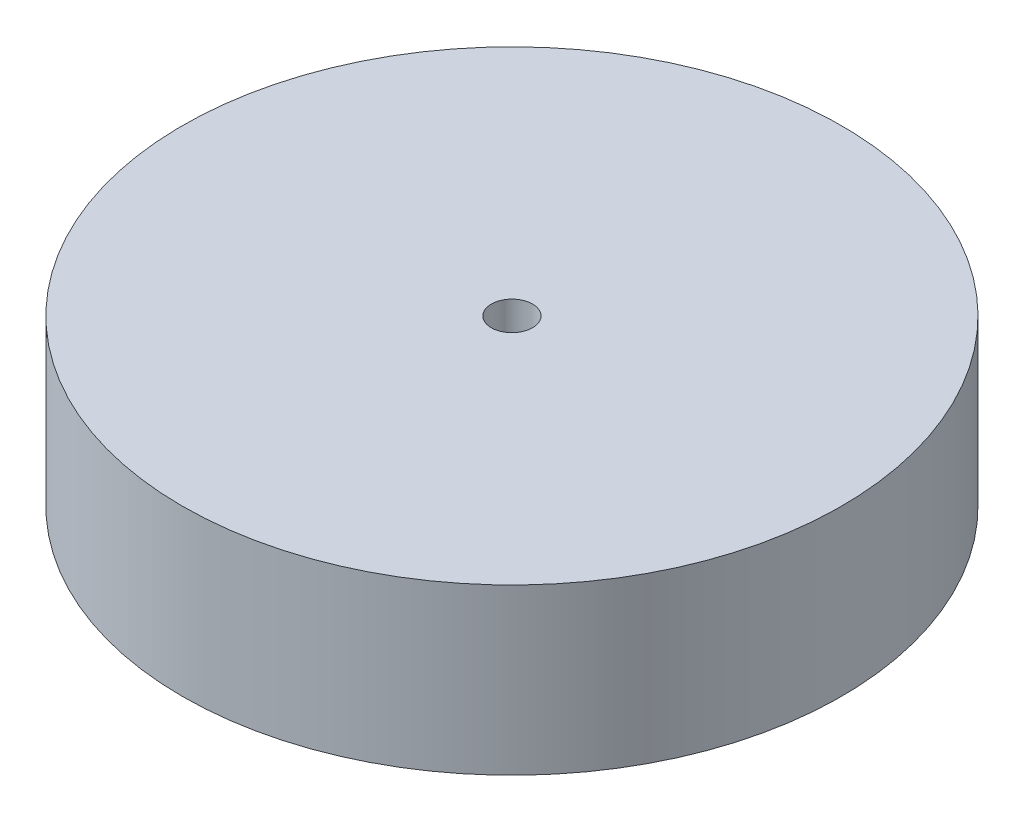
ISO-10303-21;
HEADER;
FILE_DESCRIPTION(('STEP AP214'),'2;1');
FILE_NAME('part.step','',(''),(''),'','','');
FILE_SCHEMA(('AUTOMOTIVE_DESIGN { 1 0 10303 214 1 1 1 1 }'));
ENDSEC;
DATA;
#1=APPLICATION_CONTEXT('core data for automotive mechanical design processes');
#2=APPLICATION_PROTOCOL_DEFINITION('international standard','automotive_design',2000,#1);
#3=PRODUCT_CONTEXT('',#1,'mechanical');
#4=PRODUCT('Part','Part','',(#3));
#5=PRODUCT_RELATED_PRODUCT_CATEGORY('part','',(#4));
#6=PRODUCT_DEFINITION_FORMATION('','',#4);
#7=PRODUCT_DEFINITION_CONTEXT('part definition',#1,'design');
#8=PRODUCT_DEFINITION('design','',#6,#7);
#9=PRODUCT_DEFINITION_SHAPE('','',#8);
#10=(LENGTH_UNIT() NAMED_UNIT(*) SI_UNIT(.MILLI.,.METRE.));
#11=(NAMED_UNIT(*) PLANE_ANGLE_UNIT() SI_UNIT($,.RADIAN.));
#12=(NAMED_UNIT(*) SI_UNIT($,.STERADIAN.) SOLID_ANGLE_UNIT());
#13=UNCERTAINTY_MEASURE_WITH_UNIT(LENGTH_MEASURE(1.E-05),#10,'distance_accuracy_value','');
#14=(GEOMETRIC_REPRESENTATION_CONTEXT(3) GLOBAL_UNCERTAINTY_ASSIGNED_CONTEXT((#13)) GLOBAL_UNIT_ASSIGNED_CONTEXT((#10,
#11,#12)) REPRESENTATION_CONTEXT('',''));
#15=CARTESIAN_POINT('',(0.,0.,0.));
#16=DIRECTION('',(0.,0.,1.));
#17=DIRECTION('',(1.,0.,0.));
#18=AXIS2_PLACEMENT_3D('',#15,#16,#17);
#19=CARTESIAN_POINT('',(0.,31.75,0.));
#20=DIRECTION('',(0.,1.,0.));
#21=DIRECTION('',(0.,0.,1.));
#22=AXIS2_PLACEMENT_3D('',#19,#20,#21);
#23=PLANE('',#22);
#24=CARTESIAN_POINT('',(0.,31.75,0.));
#25=DIRECTION('',(0.,1.,0.));
#26=DIRECTION('',(0.,0.,1.));
#27=AXIS2_PLACEMENT_3D('',#24,#25,#26);
#28=CIRCLE('',#27,63.5);
#29=CARTESIAN_POINT('',(0.,31.75,63.5));
#30=VERTEX_POINT('',#29);
#31=EDGE_CURVE('E10',#30,#30,#28,.T.);
#32=ORIENTED_EDGE('',*,*,#31,.T.);
#33=EDGE_LOOP('',(#32));
#34=FACE_BOUND('',#33,.T.);
#35=CARTESIAN_POINT('',(0.,31.75,0.));
#36=DIRECTION('',(0.,1.,0.));
#37=DIRECTION('',(0.,0.,1.));
#38=AXIS2_PLACEMENT_3D('',#35,#36,#37);
#39=CIRCLE('',#38,3.96875);
#40=CARTESIAN_POINT('',(0.,31.75,3.96875));
#41=VERTEX_POINT('',#40);
#42=EDGE_CURVE('E54',#41,#41,#39,.T.);
#43=ORIENTED_EDGE('',*,*,#42,.F.);
#44=EDGE_LOOP('',(#43));
#45=FACE_BOUND('',#44,.T.);
#46=ADVANCED_FACE('F41',(#34,#45),#23,.T.);
#47=CARTESIAN_POINT('',(0.,0.,0.));
#48=DIRECTION('',(0.,1.,0.));
#49=DIRECTION('',(0.,0.,1.));
#50=AXIS2_PLACEMENT_3D('',#47,#48,#49);
#51=PLANE('',#50);
#52=CARTESIAN_POINT('',(0.,0.,0.));
#53=DIRECTION('',(0.,1.,0.));
#54=DIRECTION('',(0.,0.,1.));
#55=AXIS2_PLACEMENT_3D('',#52,#53,#54);
#56=CIRCLE('',#55,63.5);
#57=CARTESIAN_POINT('',(0.,0.,63.5));
#58=VERTEX_POINT('',#57);
#59=EDGE_CURVE('E45',#58,#58,#56,.T.);
#60=ORIENTED_EDGE('',*,*,#59,.F.);
#61=EDGE_LOOP('',(#60));
#62=FACE_BOUND('',#61,.T.);
#63=CARTESIAN_POINT('',(0.,0.,0.));
#64=DIRECTION('',(0.,1.,0.));
#65=DIRECTION('',(0.,0.,1.));
#66=AXIS2_PLACEMENT_3D('',#63,#64,#65);
#67=CIRCLE('',#66,3.96875);
#68=CARTESIAN_POINT('',(0.,0.,3.96875));
#69=VERTEX_POINT('',#68);
#70=EDGE_CURVE('E56',#69,#69,#67,.T.);
#71=ORIENTED_EDGE('',*,*,#70,.T.);
#72=EDGE_LOOP('',(#71));
#73=FACE_BOUND('',#72,.T.);
#74=ADVANCED_FACE('F68',(#62,#73),#51,.F.);
#75=CARTESIAN_POINT('',(0.,31.75,0.));
#76=DIRECTION('',(0.,-1.,0.));
#77=DIRECTION('',(0.,0.,-1.));
#78=AXIS2_PLACEMENT_3D('',#75,#76,#77);
#79=CYLINDRICAL_SURFACE('',#78,63.5);
#80=ORIENTED_EDGE('',*,*,#31,.F.);
#81=EDGE_LOOP('',(#80));
#82=FACE_BOUND('',#81,.T.);
#83=ORIENTED_EDGE('',*,*,#59,.T.);
#84=EDGE_LOOP('',(#83));
#85=FACE_BOUND('',#84,.T.);
#86=ADVANCED_FACE('F43',(#82,#85),#79,.T.);
#87=CARTESIAN_POINT('',(0.,31.75,0.));
#88=DIRECTION('',(0.,-1.,0.));
#89=DIRECTION('',(0.,0.,-1.));
#90=AXIS2_PLACEMENT_3D('',#87,#88,#89);
#91=CYLINDRICAL_SURFACE('',#90,3.96875);
#92=ORIENTED_EDGE('',*,*,#42,.T.);
#93=EDGE_LOOP('',(#92));
#94=FACE_BOUND('',#93,.T.);
#95=ORIENTED_EDGE('',*,*,#70,.F.);
#96=EDGE_LOOP('',(#95));
#97=FACE_BOUND('',#96,.T.);
#98=ADVANCED_FACE('F64',(#94,#97),#91,.F.);
#99=CLOSED_SHELL('',(#46,#74,#86,#98));
#100=MANIFOLD_SOLID_BREP('B2',#99);
#101=ADVANCED_BREP_SHAPE_REPRESENTATION('',(#18,#100),#14);
#102=SHAPE_DEFINITION_REPRESENTATION(#9,#101);
ENDSEC;
END-ISO-10303-21;
